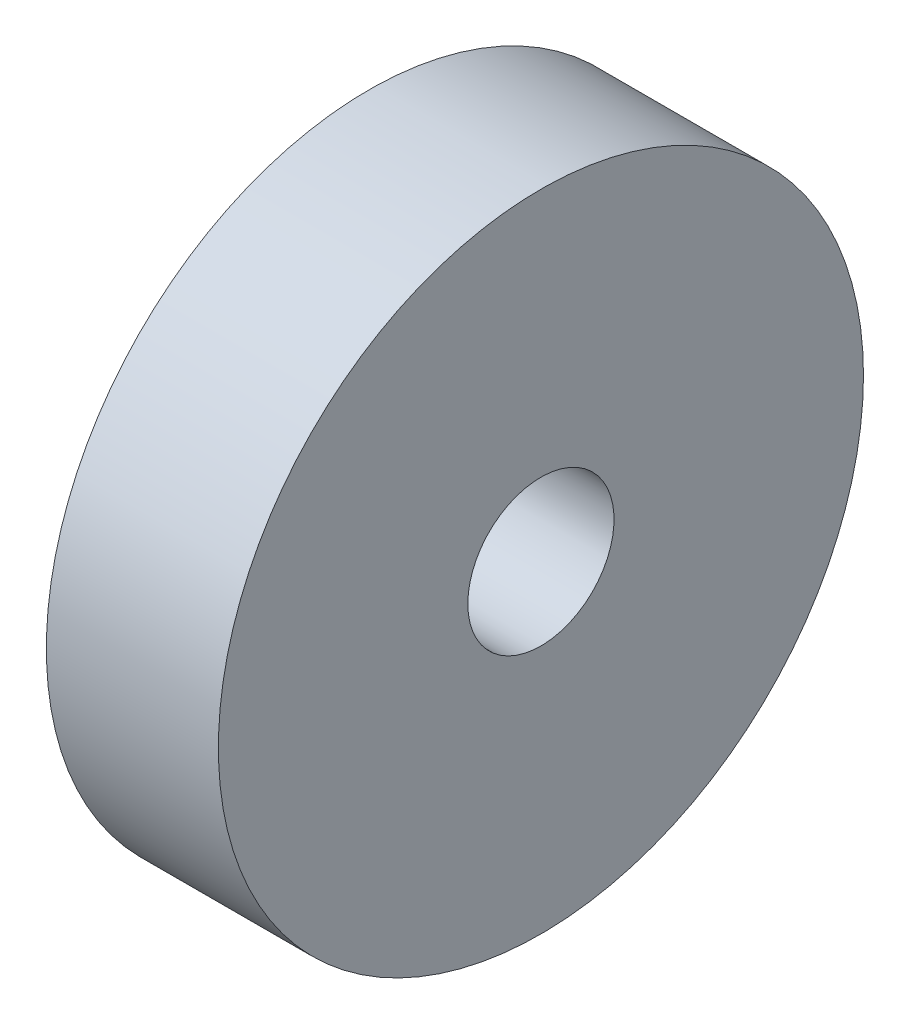
ISO-10303-21;
HEADER;
FILE_DESCRIPTION(('STEP AP214'),'2;1');
FILE_NAME('part.step','',(''),(''),'','','');
FILE_SCHEMA(('AUTOMOTIVE_DESIGN { 1 0 10303 214 1 1 1 1 }'));
ENDSEC;
DATA;
#1=APPLICATION_CONTEXT('core data for automotive mechanical design processes');
#2=APPLICATION_PROTOCOL_DEFINITION('international standard','automotive_design',2000,#1);
#3=PRODUCT_CONTEXT('',#1,'mechanical');
#4=PRODUCT('Part','Part','',(#3));
#5=PRODUCT_RELATED_PRODUCT_CATEGORY('part','',(#4));
#6=PRODUCT_DEFINITION_FORMATION('','',#4);
#7=PRODUCT_DEFINITION_CONTEXT('part definition',#1,'design');
#8=PRODUCT_DEFINITION('design','',#6,#7);
#9=PRODUCT_DEFINITION_SHAPE('','',#8);
#10=(LENGTH_UNIT() NAMED_UNIT(*) SI_UNIT(.MILLI.,.METRE.));
#11=(NAMED_UNIT(*) PLANE_ANGLE_UNIT() SI_UNIT($,.RADIAN.));
#12=(NAMED_UNIT(*) SI_UNIT($,.STERADIAN.) SOLID_ANGLE_UNIT());
#13=UNCERTAINTY_MEASURE_WITH_UNIT(LENGTH_MEASURE(1.E-05),#10,'distance_accuracy_value','');
#14=(GEOMETRIC_REPRESENTATION_CONTEXT(3) GLOBAL_UNCERTAINTY_ASSIGNED_CONTEXT((#13)) GLOBAL_UNIT_ASSIGNED_CONTEXT((#10,
#11,#12)) REPRESENTATION_CONTEXT('',''));
#15=CARTESIAN_POINT('',(0.,0.,0.));
#16=DIRECTION('',(0.,0.,1.));
#17=DIRECTION('',(1.,0.,0.));
#18=AXIS2_PLACEMENT_3D('',#15,#16,#17);
#19=CARTESIAN_POINT('',(20.,0.,0.));
#20=DIRECTION('',(-1.,0.,0.));
#21=DIRECTION('',(0.,0.,1.));
#22=AXIS2_PLACEMENT_3D('',#19,#20,#21);
#23=CYLINDRICAL_SURFACE('',#22,37.5);
#24=CARTESIAN_POINT('',(20.,0.,0.));
#25=DIRECTION('',(1.,0.,0.));
#26=DIRECTION('',(0.,0.,-1.));
#27=AXIS2_PLACEMENT_3D('',#24,#25,#26);
#28=CIRCLE('',#27,37.5);
#29=CARTESIAN_POINT('',(20.,0.,-37.5));
#30=VERTEX_POINT('',#29);
#31=EDGE_CURVE('E10',#30,#30,#28,.T.);
#32=ORIENTED_EDGE('',*,*,#31,.F.);
#33=EDGE_LOOP('',(#32));
#34=FACE_BOUND('',#33,.T.);
#35=CARTESIAN_POINT('',(0.,0.,0.));
#36=DIRECTION('',(1.,0.,0.));
#37=DIRECTION('',(0.,0.,-1.));
#38=AXIS2_PLACEMENT_3D('',#35,#36,#37);
#39=CIRCLE('',#38,37.5);
#40=CARTESIAN_POINT('',(0.,0.,-37.5));
#41=VERTEX_POINT('',#40);
#42=EDGE_CURVE('E39',#41,#41,#39,.T.);
#43=ORIENTED_EDGE('',*,*,#42,.T.);
#44=EDGE_LOOP('',(#43));
#45=FACE_BOUND('',#44,.T.);
#46=ADVANCED_FACE('F36',(#34,#45),#23,.T.);
#47=CARTESIAN_POINT('',(20.,0.,0.));
#48=DIRECTION('',(1.,0.,0.));
#49=DIRECTION('',(0.,0.,-1.));
#50=AXIS2_PLACEMENT_3D('',#47,#48,#49);
#51=PLANE('',#50);
#52=CARTESIAN_POINT('',(20.,0.,0.));
#53=DIRECTION('',(-1.,0.,0.));
#54=DIRECTION('',(0.,0.,1.));
#55=AXIS2_PLACEMENT_3D('',#52,#53,#54);
#56=CIRCLE('',#55,8.5);
#57=CARTESIAN_POINT('',(20.,0.,8.5));
#58=VERTEX_POINT('',#57);
#59=EDGE_CURVE('E48',#58,#58,#56,.T.);
#60=ORIENTED_EDGE('',*,*,#59,.T.);
#61=EDGE_LOOP('',(#60));
#62=FACE_BOUND('',#61,.T.);
#63=ORIENTED_EDGE('',*,*,#31,.T.);
#64=EDGE_LOOP('',(#63));
#65=FACE_BOUND('',#64,.T.);
#66=ADVANCED_FACE('F58',(#62,#65),#51,.T.);
#67=CARTESIAN_POINT('',(0.,0.,0.));
#68=DIRECTION('',(1.,0.,0.));
#69=DIRECTION('',(0.,0.,-1.));
#70=AXIS2_PLACEMENT_3D('',#67,#68,#69);
#71=PLANE('',#70);
#72=CARTESIAN_POINT('',(0.,0.,0.));
#73=DIRECTION('',(-1.,0.,0.));
#74=DIRECTION('',(0.,0.,1.));
#75=AXIS2_PLACEMENT_3D('',#72,#73,#74);
#76=CIRCLE('',#75,8.5);
#77=CARTESIAN_POINT('',(0.,0.,8.5));
#78=VERTEX_POINT('',#77);
#79=EDGE_CURVE('E50',#78,#78,#76,.T.);
#80=ORIENTED_EDGE('',*,*,#79,.F.);
#81=EDGE_LOOP('',(#80));
#82=FACE_BOUND('',#81,.T.);
#83=ORIENTED_EDGE('',*,*,#42,.F.);
#84=EDGE_LOOP('',(#83));
#85=FACE_BOUND('',#84,.T.);
#86=ADVANCED_FACE('F63',(#82,#85),#71,.F.);
#87=CARTESIAN_POINT('',(20.,0.,0.));
#88=DIRECTION('',(-1.,0.,0.));
#89=DIRECTION('',(0.,0.,1.));
#90=AXIS2_PLACEMENT_3D('',#87,#88,#89);
#91=CYLINDRICAL_SURFACE('',#90,8.5);
#92=ORIENTED_EDGE('',*,*,#59,.F.);
#93=EDGE_LOOP('',(#92));
#94=FACE_BOUND('',#93,.T.);
#95=ORIENTED_EDGE('',*,*,#79,.T.);
#96=EDGE_LOOP('',(#95));
#97=FACE_BOUND('',#96,.T.);
#98=ADVANCED_FACE('F60',(#94,#97),#91,.F.);
#99=CLOSED_SHELL('',(#46,#66,#86,#98));
#100=MANIFOLD_SOLID_BREP('B2',#99);
#101=ADVANCED_BREP_SHAPE_REPRESENTATION('',(#18,#100),#14);
#102=SHAPE_DEFINITION_REPRESENTATION(#9,#101);
ENDSEC;
END-ISO-10303-21;
